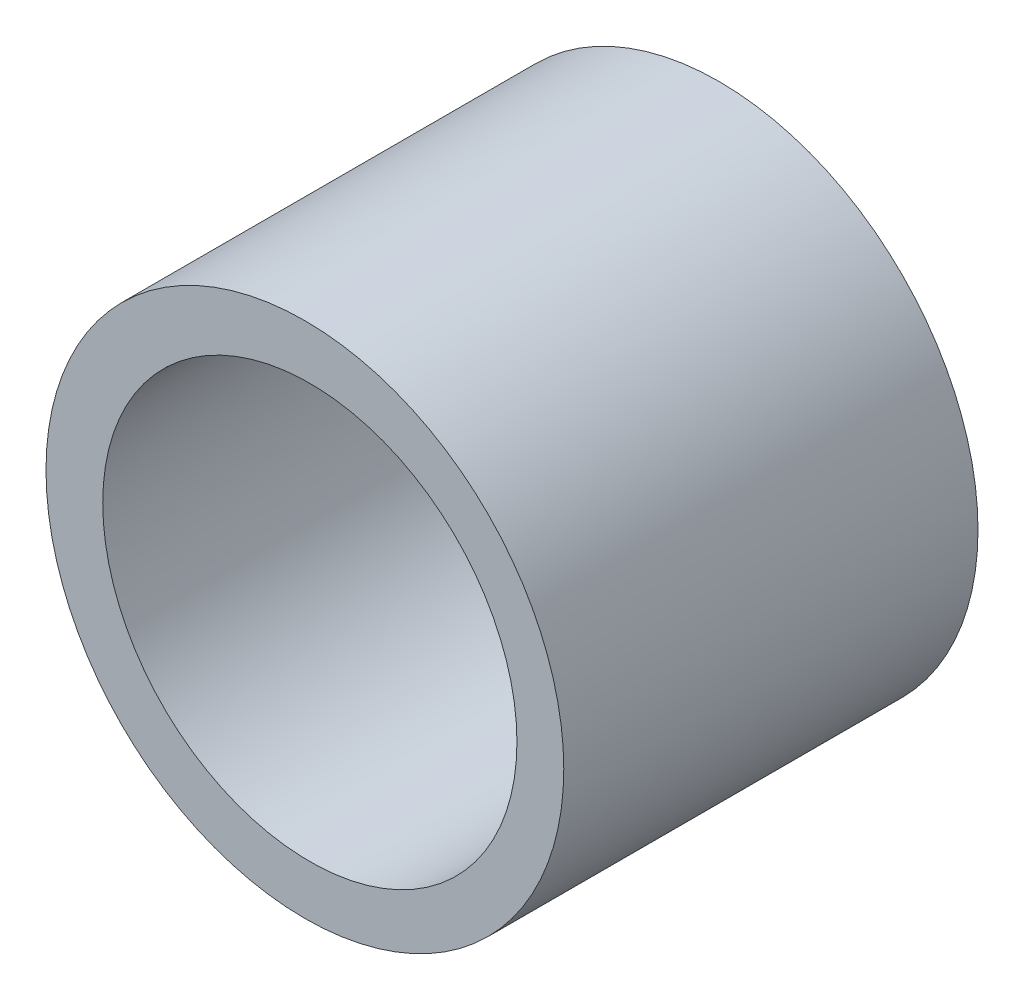
ISO-10303-21;
HEADER;
FILE_DESCRIPTION(('STEP AP214'),'2;1');
FILE_NAME('part.step','',(''),(''),'','','');
FILE_SCHEMA(('AUTOMOTIVE_DESIGN { 1 0 10303 214 1 1 1 1 }'));
ENDSEC;
DATA;
#1=APPLICATION_CONTEXT('core data for automotive mechanical design processes');
#2=APPLICATION_PROTOCOL_DEFINITION('international standard','automotive_design',2000,#1);
#3=PRODUCT_CONTEXT('',#1,'mechanical');
#4=PRODUCT('Part','Part','',(#3));
#5=PRODUCT_RELATED_PRODUCT_CATEGORY('part','',(#4));
#6=PRODUCT_DEFINITION_FORMATION('','',#4);
#7=PRODUCT_DEFINITION_CONTEXT('part definition',#1,'design');
#8=PRODUCT_DEFINITION('design','',#6,#7);
#9=PRODUCT_DEFINITION_SHAPE('','',#8);
#10=(LENGTH_UNIT() NAMED_UNIT(*) SI_UNIT(.MILLI.,.METRE.));
#11=(NAMED_UNIT(*) PLANE_ANGLE_UNIT() SI_UNIT($,.RADIAN.));
#12=(NAMED_UNIT(*) SI_UNIT($,.STERADIAN.) SOLID_ANGLE_UNIT());
#13=UNCERTAINTY_MEASURE_WITH_UNIT(LENGTH_MEASURE(1.E-05),#10,'distance_accuracy_value','');
#14=(GEOMETRIC_REPRESENTATION_CONTEXT(3) GLOBAL_UNCERTAINTY_ASSIGNED_CONTEXT((#13)) GLOBAL_UNIT_ASSIGNED_CONTEXT((#10,
#11,#12)) REPRESENTATION_CONTEXT('',''));
#15=CARTESIAN_POINT('',(0.,0.,0.));
#16=DIRECTION('',(0.,0.,1.));
#17=DIRECTION('',(1.,0.,0.));
#18=AXIS2_PLACEMENT_3D('',#15,#16,#17);
#19=CARTESIAN_POINT('',(0.,0.,20.));
#20=DIRECTION('',(0.,0.,1.));
#21=DIRECTION('',(1.,0.,0.));
#22=AXIS2_PLACEMENT_3D('',#19,#20,#21);
#23=PLANE('',#22);
#24=CARTESIAN_POINT('',(0.,0.,20.));
#25=DIRECTION('',(0.,0.,1.));
#26=DIRECTION('',(1.,0.,0.));
#27=AXIS2_PLACEMENT_3D('',#24,#25,#26);
#28=CIRCLE('',#27,25.);
#29=CARTESIAN_POINT('',(25.,0.,20.));
#30=VERTEX_POINT('',#29);
#31=EDGE_CURVE('E10',#30,#30,#28,.T.);
#32=ORIENTED_EDGE('',*,*,#31,.T.);
#33=EDGE_LOOP('',(#32));
#34=FACE_BOUND('',#33,.T.);
#35=CARTESIAN_POINT('',(0.478359132508854,0.,20.));
#36=DIRECTION('',(0.,0.,1.));
#37=DIRECTION('',(1.,0.,0.));
#38=AXIS2_PLACEMENT_3D('',#35,#36,#37);
#39=CIRCLE('',#38,20.);
#40=CARTESIAN_POINT('',(20.4783591325089,0.,20.));
#41=VERTEX_POINT('',#40);
#42=EDGE_CURVE('E42',#41,#41,#39,.T.);
#43=ORIENTED_EDGE('',*,*,#42,.F.);
#44=EDGE_LOOP('',(#43));
#45=FACE_BOUND('',#44,.T.);
#46=ADVANCED_FACE('F31',(#34,#45),#23,.T.);
#47=CARTESIAN_POINT('',(0.,0.,-20.));
#48=DIRECTION('',(0.,0.,1.));
#49=DIRECTION('',(1.,0.,0.));
#50=AXIS2_PLACEMENT_3D('',#47,#48,#49);
#51=PLANE('',#50);
#52=CARTESIAN_POINT('',(0.,0.,-20.));
#53=DIRECTION('',(0.,0.,1.));
#54=DIRECTION('',(1.,0.,0.));
#55=AXIS2_PLACEMENT_3D('',#52,#53,#54);
#56=CIRCLE('',#55,25.);
#57=CARTESIAN_POINT('',(25.,0.,-20.));
#58=VERTEX_POINT('',#57);
#59=EDGE_CURVE('E35',#58,#58,#56,.T.);
#60=ORIENTED_EDGE('',*,*,#59,.F.);
#61=EDGE_LOOP('',(#60));
#62=FACE_BOUND('',#61,.T.);
#63=CARTESIAN_POINT('',(0.478359132508854,0.,-20.));
#64=DIRECTION('',(0.,0.,1.));
#65=DIRECTION('',(1.,0.,0.));
#66=AXIS2_PLACEMENT_3D('',#63,#64,#65);
#67=CIRCLE('',#66,20.);
#68=CARTESIAN_POINT('',(20.4783591325089,0.,-20.));
#69=VERTEX_POINT('',#68);
#70=EDGE_CURVE('E44',#69,#69,#67,.T.);
#71=ORIENTED_EDGE('',*,*,#70,.T.);
#72=EDGE_LOOP('',(#71));
#73=FACE_BOUND('',#72,.T.);
#74=ADVANCED_FACE('F54',(#62,#73),#51,.F.);
#75=CARTESIAN_POINT('',(0.,0.,20.));
#76=DIRECTION('',(0.,0.,-1.));
#77=DIRECTION('',(-1.,0.,0.));
#78=AXIS2_PLACEMENT_3D('',#75,#76,#77);
#79=CYLINDRICAL_SURFACE('',#78,25.);
#80=ORIENTED_EDGE('',*,*,#31,.F.);
#81=EDGE_LOOP('',(#80));
#82=FACE_BOUND('',#81,.T.);
#83=ORIENTED_EDGE('',*,*,#59,.T.);
#84=EDGE_LOOP('',(#83));
#85=FACE_BOUND('',#84,.T.);
#86=ADVANCED_FACE('F33',(#82,#85),#79,.T.);
#87=CARTESIAN_POINT('',(0.478359132508854,0.,20.));
#88=DIRECTION('',(0.,0.,-1.));
#89=DIRECTION('',(-1.,0.,0.));
#90=AXIS2_PLACEMENT_3D('',#87,#88,#89);
#91=CYLINDRICAL_SURFACE('',#90,20.);
#92=ORIENTED_EDGE('',*,*,#42,.T.);
#93=EDGE_LOOP('',(#92));
#94=FACE_BOUND('',#93,.T.);
#95=ORIENTED_EDGE('',*,*,#70,.F.);
#96=EDGE_LOOP('',(#95));
#97=FACE_BOUND('',#96,.T.);
#98=ADVANCED_FACE('F50',(#94,#97),#91,.F.);
#99=CLOSED_SHELL('',(#46,#74,#86,#98));
#100=MANIFOLD_SOLID_BREP('B2',#99);
#101=ADVANCED_BREP_SHAPE_REPRESENTATION('',(#18,#100),#14);
#102=SHAPE_DEFINITION_REPRESENTATION(#9,#101);
ENDSEC;
END-ISO-10303-21;
